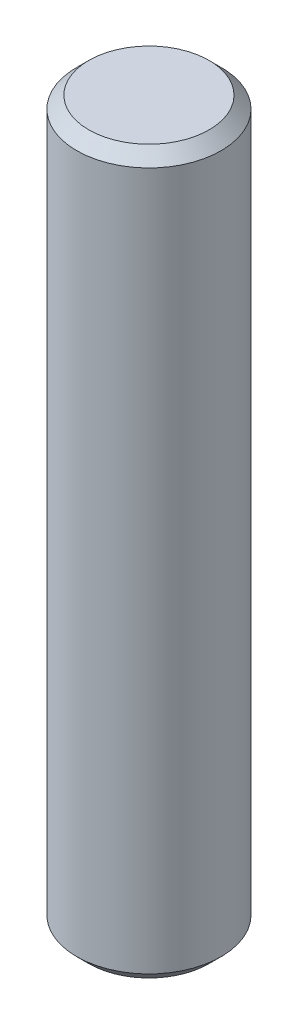
ISO-10303-21;
HEADER;
FILE_DESCRIPTION(('STEP AP214'),'2;1');
FILE_NAME('part.step','',(''),(''),'','','');
FILE_SCHEMA(('AUTOMOTIVE_DESIGN { 1 0 10303 214 1 1 1 1 }'));
ENDSEC;
DATA;
#1=APPLICATION_CONTEXT('core data for automotive mechanical design processes');
#2=APPLICATION_PROTOCOL_DEFINITION('international standard','automotive_design',2000,#1);
#3=PRODUCT_CONTEXT('',#1,'mechanical');
#4=PRODUCT('Part','Part','',(#3));
#5=PRODUCT_RELATED_PRODUCT_CATEGORY('part','',(#4));
#6=PRODUCT_DEFINITION_FORMATION('','',#4);
#7=PRODUCT_DEFINITION_CONTEXT('part definition',#1,'design');
#8=PRODUCT_DEFINITION('design','',#6,#7);
#9=PRODUCT_DEFINITION_SHAPE('','',#8);
#10=(LENGTH_UNIT() NAMED_UNIT(*) SI_UNIT(.MILLI.,.METRE.));
#11=(NAMED_UNIT(*) PLANE_ANGLE_UNIT() SI_UNIT($,.RADIAN.));
#12=(NAMED_UNIT(*) SI_UNIT($,.STERADIAN.) SOLID_ANGLE_UNIT());
#13=UNCERTAINTY_MEASURE_WITH_UNIT(LENGTH_MEASURE(1.E-05),#10,'distance_accuracy_value','');
#14=(GEOMETRIC_REPRESENTATION_CONTEXT(3) GLOBAL_UNCERTAINTY_ASSIGNED_CONTEXT((#13)) GLOBAL_UNIT_ASSIGNED_CONTEXT((#10,
#11,#12)) REPRESENTATION_CONTEXT('',''));
#15=CARTESIAN_POINT('',(0.,0.,0.));
#16=DIRECTION('',(0.,0.,1.));
#17=DIRECTION('',(1.,0.,0.));
#18=AXIS2_PLACEMENT_3D('',#15,#16,#17);
#19=CARTESIAN_POINT('',(0.,30.,0.));
#20=DIRECTION('',(0.,-1.,0.));
#21=DIRECTION('',(0.,0.,-1.));
#22=AXIS2_PLACEMENT_3D('',#19,#20,#21);
#23=CYLINDRICAL_SURFACE('',#22,3.);
#24=CARTESIAN_POINT('',(0.,0.500000000000004,0.));
#25=DIRECTION('',(0.,1.,0.));
#26=DIRECTION('',(0.,0.,1.));
#27=AXIS2_PLACEMENT_3D('',#24,#25,#26);
#28=CIRCLE('',#27,3.);
#29=CARTESIAN_POINT('',(0.,0.500000000000004,3.));
#30=VERTEX_POINT('',#29);
#31=EDGE_CURVE('E46',#30,#30,#28,.T.);
#32=ORIENTED_EDGE('',*,*,#31,.T.);
#33=EDGE_LOOP('',(#32));
#34=FACE_BOUND('',#33,.T.);
#35=CARTESIAN_POINT('',(0.,29.5,0.));
#36=DIRECTION('',(0.,1.,0.));
#37=DIRECTION('',(0.,0.,1.));
#38=AXIS2_PLACEMENT_3D('',#35,#36,#37);
#39=CIRCLE('',#38,3.);
#40=CARTESIAN_POINT('',(0.,29.5,3.));
#41=VERTEX_POINT('',#40);
#42=EDGE_CURVE('E50',#41,#41,#39,.F.);
#43=ORIENTED_EDGE('',*,*,#42,.T.);
#44=EDGE_LOOP('',(#43));
#45=FACE_BOUND('',#44,.T.);
#46=ADVANCED_FACE('F34',(#34,#45),#23,.T.);
#47=CARTESIAN_POINT('',(0.,30.,0.));
#48=DIRECTION('',(0.,1.,0.));
#49=DIRECTION('',(0.,0.,1.));
#50=AXIS2_PLACEMENT_3D('',#47,#48,#49);
#51=PLANE('',#50);
#52=CARTESIAN_POINT('',(0.,30.,0.));
#53=DIRECTION('',(0.,1.,0.));
#54=DIRECTION('',(0.,0.,1.));
#55=AXIS2_PLACEMENT_3D('',#52,#53,#54);
#56=CIRCLE('',#55,2.5);
#57=CARTESIAN_POINT('',(0.,30.,2.5));
#58=VERTEX_POINT('',#57);
#59=EDGE_CURVE('E10',#58,#58,#56,.T.);
#60=ORIENTED_EDGE('',*,*,#59,.T.);
#61=EDGE_LOOP('',(#60));
#62=FACE_BOUND('',#61,.T.);
#63=ADVANCED_FACE('F66',(#62),#51,.T.);
#64=CARTESIAN_POINT('',(0.,0.,0.));
#65=DIRECTION('',(0.,1.,0.));
#66=DIRECTION('',(0.,0.,1.));
#67=AXIS2_PLACEMENT_3D('',#64,#65,#66);
#68=PLANE('',#67);
#69=CARTESIAN_POINT('',(0.,0.,0.));
#70=DIRECTION('',(0.,1.,0.));
#71=DIRECTION('',(0.,0.,1.));
#72=AXIS2_PLACEMENT_3D('',#69,#70,#71);
#73=CIRCLE('',#72,2.5);
#74=CARTESIAN_POINT('',(0.,0.,2.5));
#75=VERTEX_POINT('',#74);
#76=EDGE_CURVE('E42',#75,#75,#73,.F.);
#77=ORIENTED_EDGE('',*,*,#76,.T.);
#78=EDGE_LOOP('',(#77));
#79=FACE_BOUND('',#78,.T.);
#80=ADVANCED_FACE('F63',(#79),#68,.F.);
#81=CARTESIAN_POINT('',(0.,0.500000000000004,0.));
#82=DIRECTION('',(0.,1.,0.));
#83=DIRECTION('',(0.,0.,1.));
#84=AXIS2_PLACEMENT_3D('',#81,#82,#83);
#85=CONICAL_SURFACE('',#84,3.,0.785398163397449);
#86=ORIENTED_EDGE('',*,*,#76,.F.);
#87=EDGE_LOOP('',(#86));
#88=FACE_BOUND('',#87,.T.);
#89=ORIENTED_EDGE('',*,*,#31,.F.);
#90=EDGE_LOOP('',(#89));
#91=FACE_BOUND('',#90,.T.);
#92=ADVANCED_FACE('F59',(#88,#91),#85,.T.);
#93=CARTESIAN_POINT('',(0.,30.,0.));
#94=DIRECTION('',(0.,-1.,0.));
#95=DIRECTION('',(0.,0.,-1.));
#96=AXIS2_PLACEMENT_3D('',#93,#94,#95);
#97=CONICAL_SURFACE('',#96,2.5,0.78539816339745);
#98=ORIENTED_EDGE('',*,*,#42,.F.);
#99=EDGE_LOOP('',(#98));
#100=FACE_BOUND('',#99,.T.);
#101=ORIENTED_EDGE('',*,*,#59,.F.);
#102=EDGE_LOOP('',(#101));
#103=FACE_BOUND('',#102,.T.);
#104=ADVANCED_FACE('F37',(#100,#103),#97,.T.);
#105=CLOSED_SHELL('',(#46,#63,#80,#92,#104));
#106=MANIFOLD_SOLID_BREP('B2',#105);
#107=ADVANCED_BREP_SHAPE_REPRESENTATION('',(#18,#106),#14);
#108=SHAPE_DEFINITION_REPRESENTATION(#9,#107);
ENDSEC;
END-ISO-10303-21;
